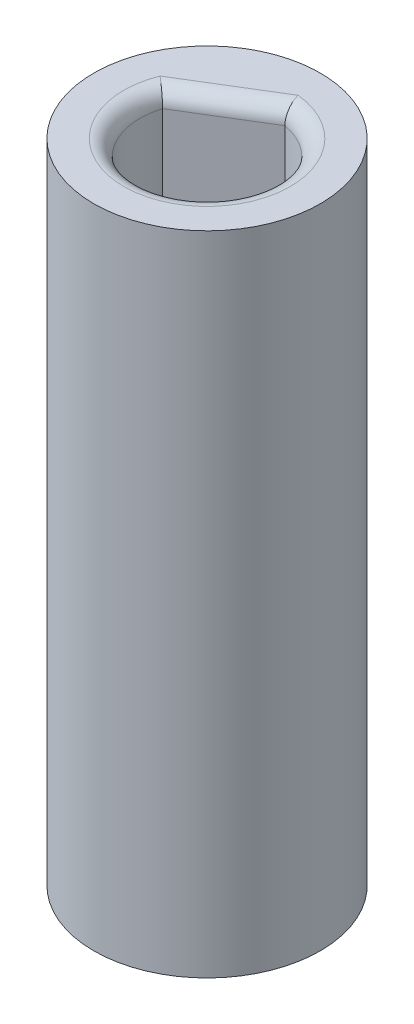
ISO-10303-21;
HEADER;
FILE_DESCRIPTION(('STEP AP214'),'2;1');
FILE_NAME('part.step','',(''),(''),'','','');
FILE_SCHEMA(('AUTOMOTIVE_DESIGN { 1 0 10303 214 1 1 1 1 }'));
ENDSEC;
DATA;
#1=APPLICATION_CONTEXT('core data for automotive mechanical design processes');
#2=APPLICATION_PROTOCOL_DEFINITION('international standard','automotive_design',2000,#1);
#3=PRODUCT_CONTEXT('',#1,'mechanical');
#4=PRODUCT('Part','Part','',(#3));
#5=PRODUCT_RELATED_PRODUCT_CATEGORY('part','',(#4));
#6=PRODUCT_DEFINITION_FORMATION('','',#4);
#7=PRODUCT_DEFINITION_CONTEXT('part definition',#1,'design');
#8=PRODUCT_DEFINITION('design','',#6,#7);
#9=PRODUCT_DEFINITION_SHAPE('','',#8);
#10=(LENGTH_UNIT() NAMED_UNIT(*) SI_UNIT(.MILLI.,.METRE.));
#11=(NAMED_UNIT(*) PLANE_ANGLE_UNIT() SI_UNIT($,.RADIAN.));
#12=(NAMED_UNIT(*) SI_UNIT($,.STERADIAN.) SOLID_ANGLE_UNIT());
#13=UNCERTAINTY_MEASURE_WITH_UNIT(LENGTH_MEASURE(1.E-05),#10,'distance_accuracy_value','');
#14=(GEOMETRIC_REPRESENTATION_CONTEXT(3) GLOBAL_UNCERTAINTY_ASSIGNED_CONTEXT((#13)) GLOBAL_UNIT_ASSIGNED_CONTEXT((#10,
#11,#12)) REPRESENTATION_CONTEXT('',''));
#15=CARTESIAN_POINT('',(0.,0.,0.));
#16=DIRECTION('',(0.,0.,1.));
#17=DIRECTION('',(1.,0.,0.));
#18=AXIS2_PLACEMENT_3D('',#15,#16,#17);
#19=CARTESIAN_POINT('',(0.,40.,0.));
#20=DIRECTION('',(0.,-1.,0.));
#21=DIRECTION('',(0.,0.,-1.));
#22=AXIS2_PLACEMENT_3D('',#19,#20,#21);
#23=CYLINDRICAL_SURFACE('',#22,4.15);
#24=DIRECTION('',(0.,-1.,0.));
#25=VECTOR('',#24,1.);
#26=CARTESIAN_POINT('',(0.726242751858062,40.,-4.08596028680818));
#27=LINE('',#26,#25);
#28=CARTESIAN_POINT('',(0.726242751858062,39.,-4.08596028680818));
#29=VERTEX_POINT('',#28);
#30=CARTESIAN_POINT('',(0.726242751858062,10.,-4.08596028680818));
#31=VERTEX_POINT('',#30);
#32=EDGE_CURVE('E81',#29,#31,#27,.T.);
#33=ORIENTED_EDGE('',*,*,#32,.T.);
#34=CARTESIAN_POINT('',(0.,10.,0.));
#35=DIRECTION('',(0.,-1.,0.));
#36=DIRECTION('',(0.,0.,-1.));
#37=AXIS2_PLACEMENT_3D('',#34,#35,#36);
#38=CIRCLE('',#37,4.15);
#39=CARTESIAN_POINT('',(-3.96709686195754,10.,-1.21845906285218));
#40=VERTEX_POINT('',#39);
#41=EDGE_CURVE('E84',#31,#40,#38,.T.);
#42=ORIENTED_EDGE('',*,*,#41,.T.);
#43=DIRECTION('',(0.,-1.,0.));
#44=VECTOR('',#43,1.);
#45=CARTESIAN_POINT('',(-3.96709686195754,40.,-1.21845906285218));
#46=LINE('',#45,#44);
#47=CARTESIAN_POINT('',(-3.96709686195754,39.,-1.21845906285218));
#48=VERTEX_POINT('',#47);
#49=EDGE_CURVE('E75',#48,#40,#46,.T.);
#50=ORIENTED_EDGE('',*,*,#49,.F.);
#51=CARTESIAN_POINT('',(0.,39.,0.));
#52=DIRECTION('',(0.,1.,0.));
#53=DIRECTION('',(0.,0.,1.));
#54=AXIS2_PLACEMENT_3D('',#51,#52,#53);
#55=CIRCLE('',#54,4.15);
#56=EDGE_CURVE('E48',#48,#29,#55,.T.);
#57=ORIENTED_EDGE('',*,*,#56,.T.);
#58=EDGE_LOOP('',(#33,#42,#50,#57));
#59=FACE_BOUND('',#58,.T.);
#60=ADVANCED_FACE('F39',(#59),#23,.F.);
#61=CARTESIAN_POINT('',(-1.62042705504974,40.,-2.65220967483018));
#62=DIRECTION('',(-0.521363858901092,0.,-0.853334475239201));
#63=DIRECTION('',(-0.853334475239201,0.,0.521363858901092));
#64=AXIS2_PLACEMENT_3D('',#61,#62,#63);
#65=PLANE('',#64);
#66=DIRECTION('',(-0.853334475239201,0.,0.521363858901092));
#67=VECTOR('',#66,1.);
#68=CARTESIAN_POINT('',(-1.62042705504974,10.,-2.65220967483018));
#69=LINE('',#68,#67);
#70=EDGE_CURVE('E11',#31,#40,#69,.T.);
#71=ORIENTED_EDGE('',*,*,#70,.F.);
#72=ORIENTED_EDGE('',*,*,#32,.F.);
#73=DIRECTION('',(0.853334475239201,0.,-0.521363858901092));
#74=VECTOR('',#73,1.);
#75=CARTESIAN_POINT('',(-3.96709686195754,39.,-1.21845906285218));
#76=LINE('',#75,#74);
#77=EDGE_CURVE('E78',#29,#48,#76,.F.);
#78=ORIENTED_EDGE('',*,*,#77,.T.);
#79=ORIENTED_EDGE('',*,*,#49,.T.);
#80=EDGE_LOOP('',(#71,#72,#78,#79));
#81=FACE_BOUND('',#80,.T.);
#82=ADVANCED_FACE('F77',(#81),#65,.F.);
#83=CARTESIAN_POINT('',(0.,40.,0.));
#84=DIRECTION('',(0.,-1.,0.));
#85=DIRECTION('',(0.,0.,-1.));
#86=AXIS2_PLACEMENT_3D('',#83,#84,#85);
#87=CYLINDRICAL_SURFACE('',#86,7.);
#88=CARTESIAN_POINT('',(0.,40.,0.));
#89=DIRECTION('',(0.,1.,0.));
#90=DIRECTION('',(0.,0.,1.));
#91=AXIS2_PLACEMENT_3D('',#88,#89,#90);
#92=CIRCLE('',#91,7.);
#93=CARTESIAN_POINT('',(0.,40.,7.));
#94=VERTEX_POINT('',#93);
#95=EDGE_CURVE('E121',#94,#94,#92,.T.);
#96=ORIENTED_EDGE('',*,*,#95,.F.);
#97=EDGE_LOOP('',(#96));
#98=FACE_BOUND('',#97,.T.);
#99=CARTESIAN_POINT('',(0.,0.,0.));
#100=DIRECTION('',(0.,1.,0.));
#101=DIRECTION('',(0.,0.,1.));
#102=AXIS2_PLACEMENT_3D('',#99,#100,#101);
#103=CIRCLE('',#102,7.);
#104=CARTESIAN_POINT('',(0.,0.,7.));
#105=VERTEX_POINT('',#104);
#106=EDGE_CURVE('E119',#105,#105,#103,.T.);
#107=ORIENTED_EDGE('',*,*,#106,.T.);
#108=EDGE_LOOP('',(#107));
#109=FACE_BOUND('',#108,.T.);
#110=ADVANCED_FACE('F101',(#98,#109),#87,.T.);
#111=CARTESIAN_POINT('',(0.,40.,0.));
#112=DIRECTION('',(0.,1.,0.));
#113=DIRECTION('',(0.,0.,1.));
#114=AXIS2_PLACEMENT_3D('',#111,#112,#113);
#115=PLANE('',#114);
#116=CARTESIAN_POINT('',(0.,40.,0.));
#117=DIRECTION('',(0.,1.,0.));
#118=DIRECTION('',(0.,0.,1.));
#119=AXIS2_PLACEMENT_3D('',#116,#117,#118);
#120=CIRCLE('',#119,5.15);
#121=CARTESIAN_POINT('',(0.508550009686209,40.,-5.12482944961568));
#122=VERTEX_POINT('',#121);
#123=CARTESIAN_POINT('',(-4.79213183758787,40.,-1.88625885052309));
#124=VERTEX_POINT('',#123);
#125=EDGE_CURVE('E80',#122,#124,#120,.F.);
#126=ORIENTED_EDGE('',*,*,#125,.T.);
#127=DIRECTION('',(0.853334475239201,0.,-0.521363858901092));
#128=VECTOR('',#127,1.);
#129=CARTESIAN_POINT('',(0.204878892956971,40.,-4.93929476204739));
#130=LINE('',#129,#128);
#131=EDGE_CURVE('E126',#124,#122,#130,.T.);
#132=ORIENTED_EDGE('',*,*,#131,.T.);
#133=EDGE_LOOP('',(#126,#132));
#134=FACE_BOUND('',#133,.T.);
#135=ORIENTED_EDGE('',*,*,#95,.T.);
#136=EDGE_LOOP('',(#135));
#137=FACE_BOUND('',#136,.T.);
#138=ADVANCED_FACE('F129',(#134,#137),#115,.T.);
#139=CARTESIAN_POINT('',(0.,0.,0.));
#140=DIRECTION('',(0.,1.,0.));
#141=DIRECTION('',(0.,0.,1.));
#142=AXIS2_PLACEMENT_3D('',#139,#140,#141);
#143=PLANE('',#142);
#144=ORIENTED_EDGE('',*,*,#106,.F.);
#145=EDGE_LOOP('',(#144));
#146=FACE_BOUND('',#145,.T.);
#147=ADVANCED_FACE('F106',(#146),#143,.F.);
#148=CARTESIAN_POINT('',(0.,39.,0.));
#149=DIRECTION('',(0.,1.,0.));
#150=DIRECTION('',(0.,0.,1.));
#151=AXIS2_PLACEMENT_3D('',#148,#149,#150);
#152=TOROIDAL_SURFACE('',#151,5.15,1.);
#153=CARTESIAN_POINT('',(0.726242751858062,39.,-4.08596028680818));
#154=CARTESIAN_POINT('',(0.726242640988463,39.026864109769,-4.08595935530473));
#155=CARTESIAN_POINT('',(0.726028242594108,39.0537147928427,-4.08709867880362));
#156=CARTESIAN_POINT('',(0.725172491541472,39.1072125434163,-4.0916364361139));
#157=CARTESIAN_POINT('',(0.7245312220693,39.1338596495649,-4.09503442976883));
#158=CARTESIAN_POINT('',(0.721975314021691,39.2130633938843,-4.1085537799044));
#159=CARTESIAN_POINT('',(0.719428543070324,39.2650704696804,-4.12200084519644));
#160=CARTESIAN_POINT('',(0.712705879816383,39.3660147663377,-4.15722451151088));
#161=CARTESIAN_POINT('',(0.708530366199346,39.4149526977125,-4.17899917632875));
#162=CARTESIAN_POINT('',(0.698638209520969,39.5085744146094,-4.23007023975838));
#163=CARTESIAN_POINT('',(0.69292103878178,39.5532567364236,-4.25936921362412));
#164=CARTESIAN_POINT('',(0.679875503656536,39.6385459985324,-4.32544580239446));
#165=CARTESIAN_POINT('',(0.672505254855326,39.6789973419225,-4.362415512651));
#166=CARTESIAN_POINT('',(0.656405937360438,39.7534451833272,-4.44211313264242));
#167=CARTESIAN_POINT('',(0.647676398448194,39.7874394385769,-4.48484303430813));
#168=CARTESIAN_POINT('',(0.628470144739874,39.8501551268277,-4.57757629061473));
#169=CARTESIAN_POINT('',(0.61791981287091,39.8784349517716,-4.62786287617052));
#170=CARTESIAN_POINT('',(0.59571994934448,39.9264409831671,-4.73214379695818));
#171=CARTESIAN_POINT('',(0.584070349162848,39.9461666559563,-4.78613836327416));
#172=CARTESIAN_POINT('',(0.562169189189466,39.9738743409481,-4.88622951608247));
#173=CARTESIAN_POINT('',(0.552054626230745,39.9833490862604,-4.93195200605211));
#174=CARTESIAN_POINT('',(0.531446369763087,39.9962166975776,-5.02409825721131));
#175=CARTESIAN_POINT('',(0.520953471362576,39.999621637417,-5.07052044057563));
#176=CARTESIAN_POINT('',(0.509759764855601,39.9999900886866,-5.11953667944328));
#177=CARTESIAN_POINT('',(0.509155034744944,40.0000000262002,-5.12218319187591));
#178=CARTESIAN_POINT('',(0.508550009686211,40.,-5.12482944961568));
#179=B_SPLINE_CURVE_WITH_KNOTS('',3,(#153,#154,#155,#156,#157,#158,#159,#160,#161,#162,#163,
#164,#165,#166,#167,#168,#169,#170,#171,#172,#173,#174,#175,#176,#177,#178),.UNSPECIFIED.,.F.,
.F.,(4,2,2,2,2,2,2,2,2,2,2,2,4),(0.,0.0805409520369626,0.161066213322939,0.321560139544729,
0.48201677286659,0.642528397094048,0.807690837294212,0.972910539509926,1.14809388356555,
1.32328815510163,1.4662571498722,1.60894143728141,1.6170855785214),.UNSPECIFIED.);
#180=EDGE_CURVE('E86',#29,#122,#179,.T.);
#181=ORIENTED_EDGE('',*,*,#180,.F.);
#182=ORIENTED_EDGE('',*,*,#56,.F.);
#183=CARTESIAN_POINT('',(-3.96709686195754,39.,-1.21845906285218));
#184=CARTESIAN_POINT('',(-3.96709598251356,39.026864109769,-1.21845873640304));
#185=CARTESIAN_POINT('',(-3.96801190471316,39.0537147928427,-1.21916944818071));
#186=CARTESIAN_POINT('',(-3.97165905071029,39.1072125434163,-1.22200174007009));
#187=CARTESIAN_POINT('',(-3.97438992082136,39.1338596495649,-1.22412304529361));
#188=CARTESIAN_POINT('',(-3.98525296506941,39.2130633938843,-1.23256696403441));
#189=CARTESIAN_POINT('',(-3.99605586038848,39.2650704696804,-1.24096976475633));
#190=CARTESIAN_POINT('',(-4.02432976958982,39.3660147663377,-1.26302621343537));
#191=CARTESIAN_POINT('',(-4.04179923346271,39.4149526977125,-1.27667864083456));
#192=CARTESIAN_POINT('',(-4.08272765717426,39.5085744146094,-1.30878740001442));
#193=CARTESIAN_POINT('',(-4.10618866765158,39.5532567364236,-1.32724537656197));
#194=CARTESIAN_POINT('',(-4.15902986637086,39.6385459985324,-1.36900791106525));
#195=CARTESIAN_POINT('',(-4.18856186584566,39.6789973419225,-1.39243740211531));
#196=CARTESIAN_POINT('',(-4.25212937453291,39.7534451833272,-1.44313326482021));
#197=CARTESIAN_POINT('',(-4.28616644156778,39.7874394385769,-1.47040096390989));
#198=CARTESIAN_POINT('',(-4.35991512120513,39.8501551268277,-1.52981030036875));
#199=CARTESIAN_POINT('',(-4.3998451555568,39.8784349517716,-1.56214669698431));
#200=CARTESIAN_POINT('',(-4.48250273305922,39.9264409831671,-1.62948961986673));
#201=CARTESIAN_POINT('',(-4.52523045055591,39.9461666559563,-1.6644963125635));
#202=CARTESIAN_POINT('',(-4.60429630751297,39.9738743409481,-1.72966141014128));
#203=CARTESIAN_POINT('',(-4.640364097367,39.9833490862604,-1.75952719337084));
#204=CARTESIAN_POINT('',(-4.71295064524721,39.9962166975776,-1.81991614024164));
#205=CARTESIAN_POINT('',(-4.74946836218683,39.999621637417,-1.85043787634352));
#206=CARTESIAN_POINT('',(-4.78797443766129,39.9999900886866,-1.88276701010316));
#207=CARTESIAN_POINT('',(-4.79005331823804,40.0000000262002,-1.88451285720713));
#208=CARTESIAN_POINT('',(-4.79213183758787,40.,-1.88625885052308));
#209=B_SPLINE_CURVE_WITH_KNOTS('',3,(#183,#184,#185,#186,#187,#188,#189,#190,#191,#192,#193,
#194,#195,#196,#197,#198,#199,#200,#201,#202,#203,#204,#205,#206,#207,#208),.UNSPECIFIED.,.F.,
.F.,(4,2,2,2,2,2,2,2,2,2,2,2,4),(0.,0.0805409520369696,0.161066213322946,0.321560139544729,
0.48201677286659,0.642528397094048,0.807690837294212,0.972910539509926,1.14809388356555,
1.32328815510163,1.4662571498722,1.60894143728141,1.6170855785214),.UNSPECIFIED.);
#210=EDGE_CURVE('E61',#124,#48,#209,.F.);
#211=ORIENTED_EDGE('',*,*,#210,.F.);
#212=ORIENTED_EDGE('',*,*,#125,.F.);
#213=EDGE_LOOP('',(#181,#182,#211,#212));
#214=FACE_BOUND('',#213,.T.);
#215=ADVANCED_FACE('F94',(#214),#152,.T.);
#216=CARTESIAN_POINT('',(-2.14179091395083,39.,-3.50554415006938));
#217=DIRECTION('',(-0.853334475239201,0.,0.521363858901092));
#218=DIRECTION('',(0.521363858901092,0.,0.853334475239201));
#219=AXIS2_PLACEMENT_3D('',#216,#217,#218);
#220=CYLINDRICAL_SURFACE('',#219,1.);
#221=ORIENTED_EDGE('',*,*,#210,.T.);
#222=ORIENTED_EDGE('',*,*,#77,.F.);
#223=ORIENTED_EDGE('',*,*,#180,.T.);
#224=ORIENTED_EDGE('',*,*,#131,.F.);
#225=EDGE_LOOP('',(#221,#222,#223,#224));
#226=FACE_BOUND('',#225,.T.);
#227=ADVANCED_FACE('F41',(#226),#220,.T.);
#228=CARTESIAN_POINT('',(0.,10.,0.));
#229=DIRECTION('',(0.,-1.,0.));
#230=DIRECTION('',(0.,0.,-1.));
#231=AXIS2_PLACEMENT_3D('',#228,#229,#230);
#232=PLANE('',#231);
#233=ORIENTED_EDGE('',*,*,#41,.F.);
#234=ORIENTED_EDGE('',*,*,#70,.T.);
#235=EDGE_LOOP('',(#233,#234));
#236=FACE_BOUND('',#235,.T.);
#237=ADVANCED_FACE('F88',(#236),#232,.F.);
#238=CLOSED_SHELL('',(#60,#82,#110,#138,#147,#215,#227,#237));
#239=MANIFOLD_SOLID_BREP('B2',#238);
#240=ADVANCED_BREP_SHAPE_REPRESENTATION('',(#18,#239),#14);
#241=SHAPE_DEFINITION_REPRESENTATION(#9,#240);
ENDSEC;
END-ISO-10303-21;
